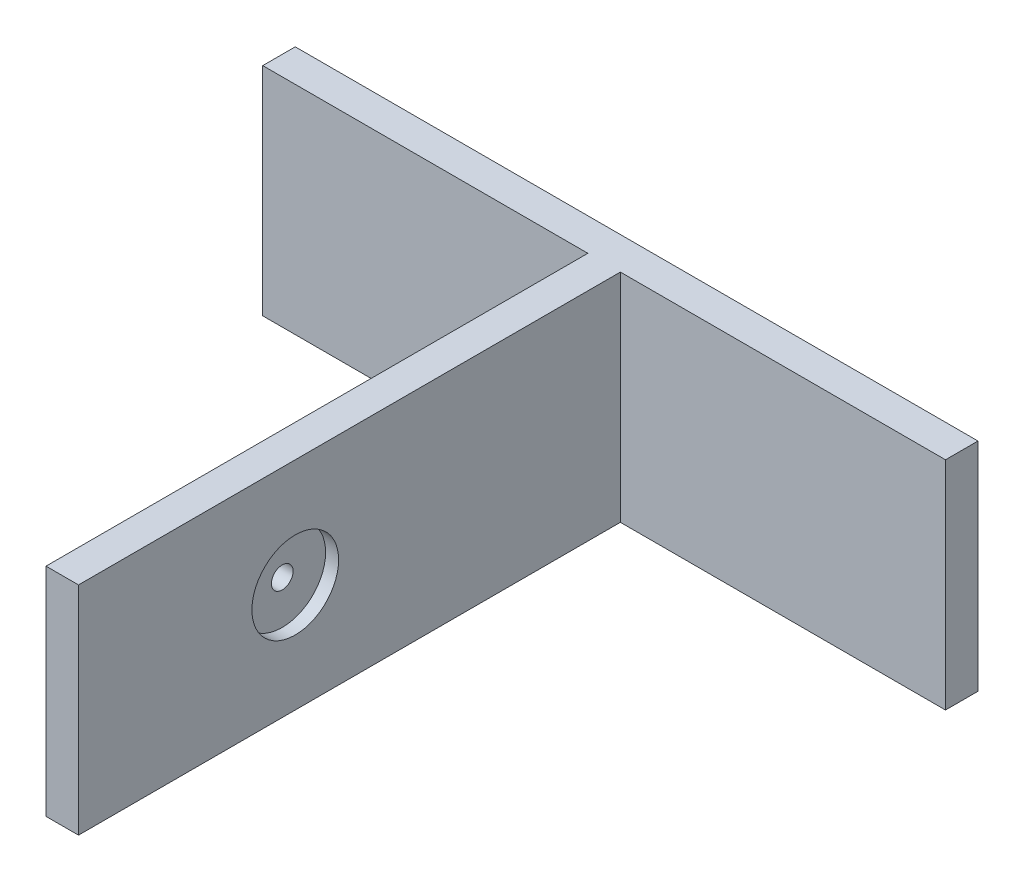
ISO-10303-21;
HEADER;
FILE_DESCRIPTION(('STEP AP214'),'2;1');
FILE_NAME('part.step','',(''),(''),'','','');
FILE_SCHEMA(('AUTOMOTIVE_DESIGN { 1 0 10303 214 1 1 1 1 }'));
ENDSEC;
DATA;
#1=APPLICATION_CONTEXT('core data for automotive mechanical design processes');
#2=APPLICATION_PROTOCOL_DEFINITION('international standard','automotive_design',2000,#1);
#3=PRODUCT_CONTEXT('',#1,'mechanical');
#4=PRODUCT('Part','Part','',(#3));
#5=PRODUCT_RELATED_PRODUCT_CATEGORY('part','',(#4));
#6=PRODUCT_DEFINITION_FORMATION('','',#4);
#7=PRODUCT_DEFINITION_CONTEXT('part definition',#1,'design');
#8=PRODUCT_DEFINITION('design','',#6,#7);
#9=PRODUCT_DEFINITION_SHAPE('','',#8);
#10=(LENGTH_UNIT() NAMED_UNIT(*) SI_UNIT(.MILLI.,.METRE.));
#11=(NAMED_UNIT(*) PLANE_ANGLE_UNIT() SI_UNIT($,.RADIAN.));
#12=(NAMED_UNIT(*) SI_UNIT($,.STERADIAN.) SOLID_ANGLE_UNIT());
#13=UNCERTAINTY_MEASURE_WITH_UNIT(LENGTH_MEASURE(1.E-05),#10,'distance_accuracy_value','');
#14=(GEOMETRIC_REPRESENTATION_CONTEXT(3) GLOBAL_UNCERTAINTY_ASSIGNED_CONTEXT((#13)) GLOBAL_UNIT_ASSIGNED_CONTEXT((#10,
#11,#12)) REPRESENTATION_CONTEXT('',''));
#15=CARTESIAN_POINT('',(0.,0.,0.));
#16=DIRECTION('',(0.,0.,1.));
#17=DIRECTION('',(1.,0.,0.));
#18=AXIS2_PLACEMENT_3D('',#15,#16,#17);
#19=CARTESIAN_POINT('',(0.216639789933359,20.,38.1975975054586));
#20=DIRECTION('',(0.,0.,-1.));
#21=DIRECTION('',(-1.,0.,0.));
#22=AXIS2_PLACEMENT_3D('',#19,#20,#21);
#23=PLANE('',#22);
#24=DIRECTION('',(1.,0.,0.));
#25=VECTOR('',#24,1.);
#26=CARTESIAN_POINT('',(0.216639789933359,0.,38.1975975054586));
#27=LINE('',#26,#25);
#28=CARTESIAN_POINT('',(0.216639789933359,0.,38.1975975054586));
#29=VERTEX_POINT('',#28);
#30=CARTESIAN_POINT('',(3.21663978993336,0.,38.1975975054586));
#31=VERTEX_POINT('',#30);
#32=EDGE_CURVE('E132',#29,#31,#27,.T.);
#33=ORIENTED_EDGE('',*,*,#32,.T.);
#34=DIRECTION('',(0.,-1.,0.));
#35=VECTOR('',#34,1.);
#36=CARTESIAN_POINT('',(3.21663978993336,20.,38.1975975054586));
#37=LINE('',#36,#35);
#38=CARTESIAN_POINT('',(3.21663978993336,20.,38.1975975054586));
#39=VERTEX_POINT('',#38);
#40=EDGE_CURVE('E43',#39,#31,#37,.T.);
#41=ORIENTED_EDGE('',*,*,#40,.F.);
#42=DIRECTION('',(1.,0.,0.));
#43=VECTOR('',#42,1.);
#44=CARTESIAN_POINT('',(0.216639789933359,20.,38.1975975054586));
#45=LINE('',#44,#43);
#46=CARTESIAN_POINT('',(0.216639789933359,20.,38.1975975054586));
#47=VERTEX_POINT('',#46);
#48=EDGE_CURVE('E147',#47,#39,#45,.T.);
#49=ORIENTED_EDGE('',*,*,#48,.F.);
#50=DIRECTION('',(0.,-1.,0.));
#51=VECTOR('',#50,1.);
#52=CARTESIAN_POINT('',(0.216639789933359,20.,38.1975975054586));
#53=LINE('',#52,#51);
#54=EDGE_CURVE('E128',#47,#29,#53,.T.);
#55=ORIENTED_EDGE('',*,*,#54,.T.);
#56=EDGE_LOOP('',(#33,#41,#49,#55));
#57=FACE_BOUND('',#56,.T.);
#58=ADVANCED_FACE('F35',(#57),#23,.F.);
#59=CARTESIAN_POINT('',(3.21663978993336,20.,38.1975975054586));
#60=DIRECTION('',(-1.,0.,0.));
#61=DIRECTION('',(0.,0.,1.));
#62=AXIS2_PLACEMENT_3D('',#59,#60,#61);
#63=PLANE('',#62);
#64=CARTESIAN_POINT('',(3.21663978993336,10.,18.1975975054586));
#65=DIRECTION('',(1.,0.,0.));
#66=DIRECTION('',(0.,0.,-1.));
#67=AXIS2_PLACEMENT_3D('',#64,#65,#66);
#68=CIRCLE('',#67,4.);
#69=CARTESIAN_POINT('',(3.21663978993336,10.,14.1975975054586));
#70=VERTEX_POINT('',#69);
#71=EDGE_CURVE('E184',#70,#70,#68,.T.);
#72=ORIENTED_EDGE('',*,*,#71,.F.);
#73=EDGE_LOOP('',(#72));
#74=FACE_BOUND('',#73,.T.);
#75=DIRECTION('',(0.,0.,-1.));
#76=VECTOR('',#75,1.);
#77=CARTESIAN_POINT('',(3.21663978993336,0.,38.1975975054586));
#78=LINE('',#77,#76);
#79=CARTESIAN_POINT('',(3.21663978993336,0.,-11.8024024945414));
#80=VERTEX_POINT('',#79);
#81=EDGE_CURVE('E135',#31,#80,#78,.T.);
#82=ORIENTED_EDGE('',*,*,#81,.T.);
#83=DIRECTION('',(0.,-1.,0.));
#84=VECTOR('',#83,1.);
#85=CARTESIAN_POINT('',(3.21663978993336,20.,-11.8024024945414));
#86=LINE('',#85,#84);
#87=CARTESIAN_POINT('',(3.21663978993336,20.,-11.8024024945414));
#88=VERTEX_POINT('',#87);
#89=EDGE_CURVE('E157',#88,#80,#86,.T.);
#90=ORIENTED_EDGE('',*,*,#89,.F.);
#91=DIRECTION('',(0.,0.,-1.));
#92=VECTOR('',#91,1.);
#93=CARTESIAN_POINT('',(3.21663978993336,20.,38.1975975054586));
#94=LINE('',#93,#92);
#95=EDGE_CURVE('E95',#39,#88,#94,.T.);
#96=ORIENTED_EDGE('',*,*,#95,.F.);
#97=ORIENTED_EDGE('',*,*,#40,.T.);
#98=EDGE_LOOP('',(#82,#90,#96,#97));
#99=FACE_BOUND('',#98,.T.);
#100=ADVANCED_FACE('F160',(#74,#99),#63,.F.);
#101=CARTESIAN_POINT('',(3.21663978993336,20.,-11.8024024945414));
#102=DIRECTION('',(0.,0.,-1.));
#103=DIRECTION('',(-1.,0.,0.));
#104=AXIS2_PLACEMENT_3D('',#101,#102,#103);
#105=PLANE('',#104);
#106=DIRECTION('',(1.,0.,0.));
#107=VECTOR('',#106,1.);
#108=CARTESIAN_POINT('',(3.21663978993336,0.,-11.8024024945414));
#109=LINE('',#108,#107);
#110=CARTESIAN_POINT('',(33.2166397899334,0.,-11.8024024945414));
#111=VERTEX_POINT('',#110);
#112=EDGE_CURVE('E138',#80,#111,#109,.T.);
#113=ORIENTED_EDGE('',*,*,#112,.T.);
#114=DIRECTION('',(0.,-1.,0.));
#115=VECTOR('',#114,1.);
#116=CARTESIAN_POINT('',(33.2166397899334,20.,-11.8024024945414));
#117=LINE('',#116,#115);
#118=CARTESIAN_POINT('',(33.2166397899334,20.,-11.8024024945414));
#119=VERTEX_POINT('',#118);
#120=EDGE_CURVE('E154',#119,#111,#117,.T.);
#121=ORIENTED_EDGE('',*,*,#120,.F.);
#122=DIRECTION('',(1.,0.,0.));
#123=VECTOR('',#122,1.);
#124=CARTESIAN_POINT('',(3.21663978993336,20.,-11.8024024945414));
#125=LINE('',#124,#123);
#126=EDGE_CURVE('E178',#88,#119,#125,.T.);
#127=ORIENTED_EDGE('',*,*,#126,.F.);
#128=ORIENTED_EDGE('',*,*,#89,.T.);
#129=EDGE_LOOP('',(#113,#121,#127,#128));
#130=FACE_BOUND('',#129,.T.);
#131=ADVANCED_FACE('F171',(#130),#105,.F.);
#132=CARTESIAN_POINT('',(33.2166397899334,20.,-11.8024024945414));
#133=DIRECTION('',(-1.,0.,0.));
#134=DIRECTION('',(0.,0.,1.));
#135=AXIS2_PLACEMENT_3D('',#132,#133,#134);
#136=PLANE('',#135);
#137=DIRECTION('',(0.,0.,-1.));
#138=VECTOR('',#137,1.);
#139=CARTESIAN_POINT('',(33.2166397899334,0.,-11.8024024945414));
#140=LINE('',#139,#138);
#141=CARTESIAN_POINT('',(33.2166397899334,0.,-14.8024024945414));
#142=VERTEX_POINT('',#141);
#143=EDGE_CURVE('E140',#111,#142,#140,.T.);
#144=ORIENTED_EDGE('',*,*,#143,.T.);
#145=DIRECTION('',(0.,-1.,0.));
#146=VECTOR('',#145,1.);
#147=CARTESIAN_POINT('',(33.2166397899334,20.,-14.8024024945414));
#148=LINE('',#147,#146);
#149=CARTESIAN_POINT('',(33.2166397899334,20.,-14.8024024945414));
#150=VERTEX_POINT('',#149);
#151=EDGE_CURVE('E151',#150,#142,#148,.T.);
#152=ORIENTED_EDGE('',*,*,#151,.F.);
#153=DIRECTION('',(0.,0.,-1.));
#154=VECTOR('',#153,1.);
#155=CARTESIAN_POINT('',(33.2166397899334,20.,-11.8024024945414));
#156=LINE('',#155,#154);
#157=EDGE_CURVE('E177',#119,#150,#156,.T.);
#158=ORIENTED_EDGE('',*,*,#157,.F.);
#159=ORIENTED_EDGE('',*,*,#120,.T.);
#160=EDGE_LOOP('',(#144,#152,#158,#159));
#161=FACE_BOUND('',#160,.T.);
#162=ADVANCED_FACE('F175',(#161),#136,.F.);
#163=CARTESIAN_POINT('',(33.2166397899334,20.,-14.8024024945414));
#164=DIRECTION('',(0.,0.,1.));
#165=DIRECTION('',(1.,0.,0.));
#166=AXIS2_PLACEMENT_3D('',#163,#164,#165);
#167=PLANE('',#166);
#168=CARTESIAN_POINT('',(1.71663978993336,10.,-14.8024024945414));
#169=DIRECTION('',(0.,0.,1.));
#170=DIRECTION('',(1.,0.,0.));
#171=AXIS2_PLACEMENT_3D('',#168,#169,#170);
#172=CIRCLE('',#171,1.);
#173=CARTESIAN_POINT('',(2.71663978993336,10.,-14.8024024945414));
#174=VERTEX_POINT('',#173);
#175=EDGE_CURVE('E11',#174,#174,#172,.F.);
#176=ORIENTED_EDGE('',*,*,#175,.F.);
#177=EDGE_LOOP('',(#176));
#178=FACE_BOUND('',#177,.T.);
#179=DIRECTION('',(-1.,0.,0.));
#180=VECTOR('',#179,1.);
#181=CARTESIAN_POINT('',(33.2166397899334,0.,-14.8024024945414));
#182=LINE('',#181,#180);
#183=CARTESIAN_POINT('',(-29.7833602100666,0.,-14.8024024945414));
#184=VERTEX_POINT('',#183);
#185=EDGE_CURVE('E142',#142,#184,#182,.T.);
#186=ORIENTED_EDGE('',*,*,#185,.T.);
#187=DIRECTION('',(0.,-1.,0.));
#188=VECTOR('',#187,1.);
#189=CARTESIAN_POINT('',(-29.7833602100666,20.,-14.8024024945414));
#190=LINE('',#189,#188);
#191=CARTESIAN_POINT('',(-29.7833602100666,20.,-14.8024024945414));
#192=VERTEX_POINT('',#191);
#193=EDGE_CURVE('E123',#192,#184,#190,.T.);
#194=ORIENTED_EDGE('',*,*,#193,.F.);
#195=DIRECTION('',(-1.,0.,0.));
#196=VECTOR('',#195,1.);
#197=CARTESIAN_POINT('',(33.2166397899334,20.,-14.8024024945414));
#198=LINE('',#197,#196);
#199=EDGE_CURVE('E114',#150,#192,#198,.T.);
#200=ORIENTED_EDGE('',*,*,#199,.F.);
#201=ORIENTED_EDGE('',*,*,#151,.T.);
#202=EDGE_LOOP('',(#186,#194,#200,#201));
#203=FACE_BOUND('',#202,.T.);
#204=ADVANCED_FACE('F208',(#178,#203),#167,.F.);
#205=CARTESIAN_POINT('',(-29.7833602100666,20.,-14.8024024945414));
#206=DIRECTION('',(1.,0.,0.));
#207=DIRECTION('',(0.,0.,-1.));
#208=AXIS2_PLACEMENT_3D('',#205,#206,#207);
#209=PLANE('',#208);
#210=DIRECTION('',(0.,0.,1.));
#211=VECTOR('',#210,1.);
#212=CARTESIAN_POINT('',(-29.7833602100666,0.,-14.8024024945414));
#213=LINE('',#212,#211);
#214=CARTESIAN_POINT('',(-29.7833602100666,0.,-11.8024024945414));
#215=VERTEX_POINT('',#214);
#216=EDGE_CURVE('E122',#184,#215,#213,.T.);
#217=ORIENTED_EDGE('',*,*,#216,.T.);
#218=DIRECTION('',(0.,-1.,0.));
#219=VECTOR('',#218,1.);
#220=CARTESIAN_POINT('',(-29.7833602100666,20.,-11.8024024945414));
#221=LINE('',#220,#219);
#222=CARTESIAN_POINT('',(-29.7833602100666,20.,-11.8024024945414));
#223=VERTEX_POINT('',#222);
#224=EDGE_CURVE('E119',#223,#215,#221,.T.);
#225=ORIENTED_EDGE('',*,*,#224,.F.);
#226=DIRECTION('',(0.,0.,1.));
#227=VECTOR('',#226,1.);
#228=CARTESIAN_POINT('',(-29.7833602100666,20.,-14.8024024945414));
#229=LINE('',#228,#227);
#230=EDGE_CURVE('E108',#192,#223,#229,.T.);
#231=ORIENTED_EDGE('',*,*,#230,.F.);
#232=ORIENTED_EDGE('',*,*,#193,.T.);
#233=EDGE_LOOP('',(#217,#225,#231,#232));
#234=FACE_BOUND('',#233,.T.);
#235=ADVANCED_FACE('F120',(#234),#209,.F.);
#236=CARTESIAN_POINT('',(-29.7833602100666,20.,-11.8024024945414));
#237=DIRECTION('',(0.,0.,-1.));
#238=DIRECTION('',(-1.,0.,0.));
#239=AXIS2_PLACEMENT_3D('',#236,#237,#238);
#240=PLANE('',#239);
#241=DIRECTION('',(1.,0.,0.));
#242=VECTOR('',#241,1.);
#243=CARTESIAN_POINT('',(-29.7833602100666,0.,-11.8024024945414));
#244=LINE('',#243,#242);
#245=CARTESIAN_POINT('',(0.216639789933359,0.,-11.8024024945414));
#246=VERTEX_POINT('',#245);
#247=EDGE_CURVE('E80',#215,#246,#244,.T.);
#248=ORIENTED_EDGE('',*,*,#247,.T.);
#249=DIRECTION('',(0.,-1.,0.));
#250=VECTOR('',#249,1.);
#251=CARTESIAN_POINT('',(0.216639789933359,20.,-11.8024024945414));
#252=LINE('',#251,#250);
#253=CARTESIAN_POINT('',(0.216639789933359,20.,-11.8024024945414));
#254=VERTEX_POINT('',#253);
#255=EDGE_CURVE('E124',#254,#246,#252,.T.);
#256=ORIENTED_EDGE('',*,*,#255,.F.);
#257=DIRECTION('',(1.,0.,0.));
#258=VECTOR('',#257,1.);
#259=CARTESIAN_POINT('',(-29.7833602100666,20.,-11.8024024945414));
#260=LINE('',#259,#258);
#261=EDGE_CURVE('E112',#223,#254,#260,.T.);
#262=ORIENTED_EDGE('',*,*,#261,.F.);
#263=ORIENTED_EDGE('',*,*,#224,.T.);
#264=EDGE_LOOP('',(#248,#256,#262,#263));
#265=FACE_BOUND('',#264,.T.);
#266=ADVANCED_FACE('F126',(#265),#240,.F.);
#267=CARTESIAN_POINT('',(0.216639789933359,20.,-11.8024024945414));
#268=DIRECTION('',(1.,0.,0.));
#269=DIRECTION('',(0.,0.,-1.));
#270=AXIS2_PLACEMENT_3D('',#267,#268,#269);
#271=PLANE('',#270);
#272=CARTESIAN_POINT('',(0.216639789933362,10.,18.1975975054586));
#273=DIRECTION('',(1.,0.,0.));
#274=DIRECTION('',(0.,0.,-1.));
#275=AXIS2_PLACEMENT_3D('',#272,#273,#274);
#276=CIRCLE('',#275,1.);
#277=CARTESIAN_POINT('',(0.216639789933362,10.,17.1975975054586));
#278=VERTEX_POINT('',#277);
#279=EDGE_CURVE('E187',#278,#278,#276,.T.);
#280=ORIENTED_EDGE('',*,*,#279,.T.);
#281=EDGE_LOOP('',(#280));
#282=FACE_BOUND('',#281,.T.);
#283=DIRECTION('',(0.,0.,1.));
#284=VECTOR('',#283,1.);
#285=CARTESIAN_POINT('',(0.216639789933359,0.,-11.8024024945414));
#286=LINE('',#285,#284);
#287=EDGE_CURVE('E86',#246,#29,#286,.T.);
#288=ORIENTED_EDGE('',*,*,#287,.T.);
#289=ORIENTED_EDGE('',*,*,#54,.F.);
#290=DIRECTION('',(0.,0.,1.));
#291=VECTOR('',#290,1.);
#292=CARTESIAN_POINT('',(0.216639789933359,20.,-11.8024024945414));
#293=LINE('',#292,#291);
#294=EDGE_CURVE('E51',#254,#47,#293,.T.);
#295=ORIENTED_EDGE('',*,*,#294,.F.);
#296=ORIENTED_EDGE('',*,*,#255,.T.);
#297=EDGE_LOOP('',(#288,#289,#295,#296));
#298=FACE_BOUND('',#297,.T.);
#299=ADVANCED_FACE('F245',(#282,#298),#271,.F.);
#300=CARTESIAN_POINT('',(0.,20.,0.));
#301=DIRECTION('',(0.,1.,0.));
#302=DIRECTION('',(0.,0.,1.));
#303=AXIS2_PLACEMENT_3D('',#300,#301,#302);
#304=PLANE('',#303);
#305=ORIENTED_EDGE('',*,*,#48,.T.);
#306=ORIENTED_EDGE('',*,*,#95,.T.);
#307=ORIENTED_EDGE('',*,*,#126,.T.);
#308=ORIENTED_EDGE('',*,*,#157,.T.);
#309=ORIENTED_EDGE('',*,*,#199,.T.);
#310=ORIENTED_EDGE('',*,*,#230,.T.);
#311=ORIENTED_EDGE('',*,*,#261,.T.);
#312=ORIENTED_EDGE('',*,*,#294,.T.);
#313=EDGE_LOOP('',(#305,#306,#307,#308,#309,#310,#311,#312));
#314=FACE_BOUND('',#313,.T.);
#315=ADVANCED_FACE('F110',(#314),#304,.T.);
#316=CARTESIAN_POINT('',(0.,0.,0.));
#317=DIRECTION('',(0.,1.,0.));
#318=DIRECTION('',(0.,0.,1.));
#319=AXIS2_PLACEMENT_3D('',#316,#317,#318);
#320=PLANE('',#319);
#321=ORIENTED_EDGE('',*,*,#32,.F.);
#322=ORIENTED_EDGE('',*,*,#287,.F.);
#323=ORIENTED_EDGE('',*,*,#247,.F.);
#324=ORIENTED_EDGE('',*,*,#216,.F.);
#325=ORIENTED_EDGE('',*,*,#185,.F.);
#326=ORIENTED_EDGE('',*,*,#143,.F.);
#327=ORIENTED_EDGE('',*,*,#112,.F.);
#328=ORIENTED_EDGE('',*,*,#81,.F.);
#329=EDGE_LOOP('',(#321,#322,#323,#324,#325,#326,#327,#328));
#330=FACE_BOUND('',#329,.T.);
#331=ADVANCED_FACE('F165',(#330),#320,.F.);
#332=CARTESIAN_POINT('',(2.01663978993336,10.,18.1975975054586));
#333=DIRECTION('',(1.,0.,0.));
#334=DIRECTION('',(0.,0.,-1.));
#335=AXIS2_PLACEMENT_3D('',#332,#333,#334);
#336=CYLINDRICAL_SURFACE('',#335,4.);
#337=CARTESIAN_POINT('',(2.01663978993336,10.,18.1975975054586));
#338=DIRECTION('',(1.,0.,0.));
#339=DIRECTION('',(0.,0.,-1.));
#340=AXIS2_PLACEMENT_3D('',#337,#338,#339);
#341=CIRCLE('',#340,4.);
#342=CARTESIAN_POINT('',(2.01663978993336,10.,14.1975975054586));
#343=VERTEX_POINT('',#342);
#344=EDGE_CURVE('E136',#343,#343,#341,.T.);
#345=ORIENTED_EDGE('',*,*,#344,.F.);
#346=EDGE_LOOP('',(#345));
#347=FACE_BOUND('',#346,.T.);
#348=ORIENTED_EDGE('',*,*,#71,.T.);
#349=EDGE_LOOP('',(#348));
#350=FACE_BOUND('',#349,.T.);
#351=ADVANCED_FACE('F229',(#347,#350),#336,.F.);
#352=CARTESIAN_POINT('',(2.01663978993336,10.,18.1975975054586));
#353=DIRECTION('',(1.,0.,0.));
#354=DIRECTION('',(0.,0.,-1.));
#355=AXIS2_PLACEMENT_3D('',#352,#353,#354);
#356=PLANE('',#355);
#357=CARTESIAN_POINT('',(2.01663978993336,10.,18.1975975054586));
#358=DIRECTION('',(1.,0.,0.));
#359=DIRECTION('',(0.,0.,-1.));
#360=AXIS2_PLACEMENT_3D('',#357,#358,#359);
#361=CIRCLE('',#360,1.);
#362=CARTESIAN_POINT('',(2.01663978993336,10.,17.1975975054586));
#363=VERTEX_POINT('',#362);
#364=EDGE_CURVE('E190',#363,#363,#361,.T.);
#365=ORIENTED_EDGE('',*,*,#364,.F.);
#366=EDGE_LOOP('',(#365));
#367=FACE_BOUND('',#366,.T.);
#368=ORIENTED_EDGE('',*,*,#344,.T.);
#369=EDGE_LOOP('',(#368));
#370=FACE_BOUND('',#369,.T.);
#371=ADVANCED_FACE('F231',(#367,#370),#356,.T.);
#372=CARTESIAN_POINT('',(0.216639789933362,10.,18.1975975054586));
#373=DIRECTION('',(1.,0.,0.));
#374=DIRECTION('',(0.,0.,-1.));
#375=AXIS2_PLACEMENT_3D('',#372,#373,#374);
#376=CYLINDRICAL_SURFACE('',#375,1.);
#377=ORIENTED_EDGE('',*,*,#279,.F.);
#378=EDGE_LOOP('',(#377));
#379=FACE_BOUND('',#378,.T.);
#380=ORIENTED_EDGE('',*,*,#364,.T.);
#381=EDGE_LOOP('',(#380));
#382=FACE_BOUND('',#381,.T.);
#383=ADVANCED_FACE('F204',(#379,#382),#376,.F.);
#384=CARTESIAN_POINT('',(1.71663978993336,10.,-15.8024024945414));
#385=DIRECTION('',(0.,0.,1.));
#386=DIRECTION('',(1.,0.,0.));
#387=AXIS2_PLACEMENT_3D('',#384,#385,#386);
#388=CYLINDRICAL_SURFACE('',#387,1.);
#389=CARTESIAN_POINT('',(1.71663978993336,10.,-15.8024024945414));
#390=DIRECTION('',(0.,0.,-1.));
#391=DIRECTION('',(-1.,0.,0.));
#392=AXIS2_PLACEMENT_3D('',#389,#390,#391);
#393=CIRCLE('',#392,1.);
#394=CARTESIAN_POINT('',(0.716639789933359,10.,-15.8024024945414));
#395=VERTEX_POINT('',#394);
#396=EDGE_CURVE('E193',#395,#395,#393,.T.);
#397=ORIENTED_EDGE('',*,*,#396,.F.);
#398=EDGE_LOOP('',(#397));
#399=FACE_BOUND('',#398,.T.);
#400=ORIENTED_EDGE('',*,*,#175,.T.);
#401=EDGE_LOOP('',(#400));
#402=FACE_BOUND('',#401,.T.);
#403=ADVANCED_FACE('F201',(#399,#402),#388,.T.);
#404=CARTESIAN_POINT('',(1.71663978993336,10.,-15.8024024945414));
#405=DIRECTION('',(0.,0.,-1.));
#406=DIRECTION('',(-1.,0.,0.));
#407=AXIS2_PLACEMENT_3D('',#404,#405,#406);
#408=PLANE('',#407);
#409=ORIENTED_EDGE('',*,*,#396,.T.);
#410=EDGE_LOOP('',(#409));
#411=FACE_BOUND('',#410,.T.);
#412=ADVANCED_FACE('F199',(#411),#408,.T.);
#413=CLOSED_SHELL('',(#58,#100,#131,#162,#204,#235,#266,#299,#315,#331,#351,#371,#383,#403,#412));
#414=MANIFOLD_SOLID_BREP('B2',#413);
#415=ADVANCED_BREP_SHAPE_REPRESENTATION('',(#18,#414),#14);
#416=SHAPE_DEFINITION_REPRESENTATION(#9,#415);
ENDSEC;
END-ISO-10303-21;
